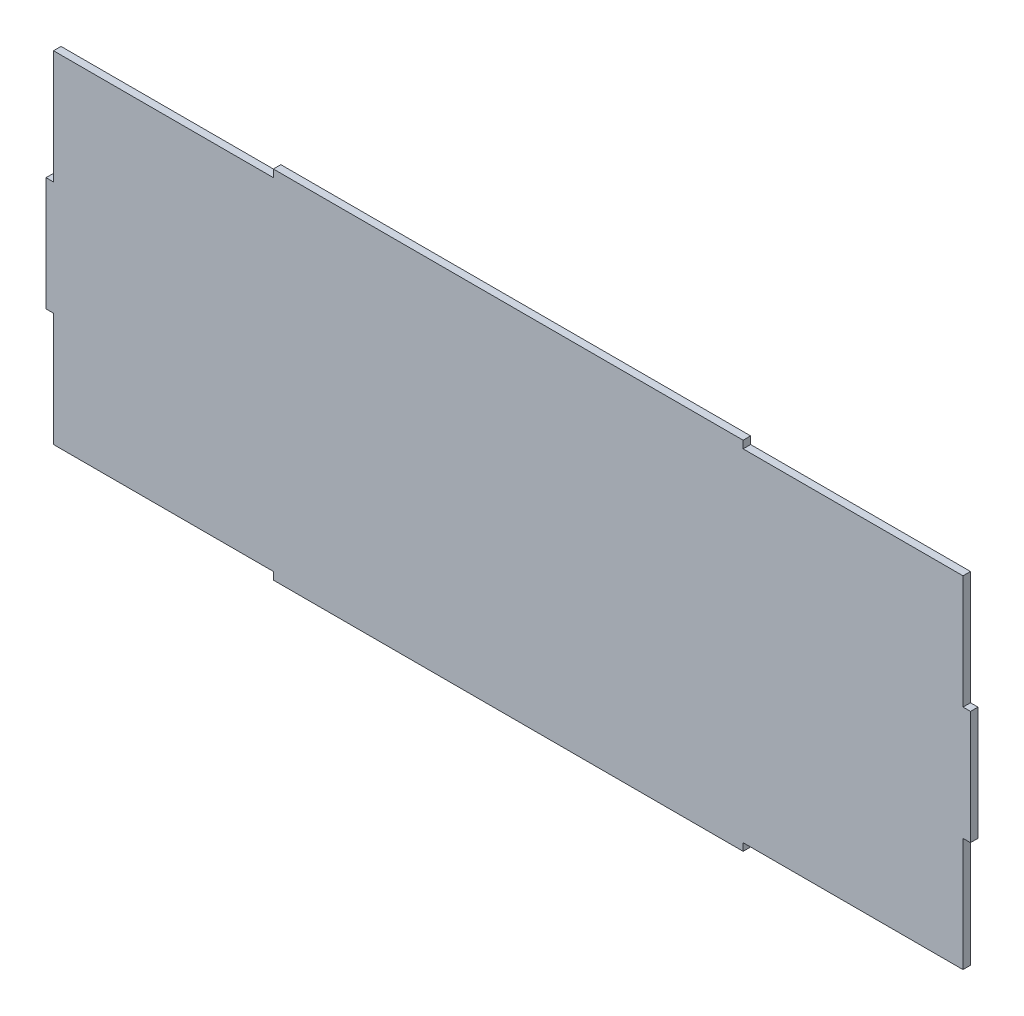
ISO-10303-21;
HEADER;
FILE_DESCRIPTION(('STEP AP214'),'2;1');
FILE_NAME('part.step','',(''),(''),'','','');
FILE_SCHEMA(('AUTOMOTIVE_DESIGN { 1 0 10303 214 1 1 1 1 }'));
ENDSEC;
DATA;
#1=APPLICATION_CONTEXT('core data for automotive mechanical design processes');
#2=APPLICATION_PROTOCOL_DEFINITION('international standard','automotive_design',2000,#1);
#3=PRODUCT_CONTEXT('',#1,'mechanical');
#4=PRODUCT('Part','Part','',(#3));
#5=PRODUCT_RELATED_PRODUCT_CATEGORY('part','',(#4));
#6=PRODUCT_DEFINITION_FORMATION('','',#4);
#7=PRODUCT_DEFINITION_CONTEXT('part definition',#1,'design');
#8=PRODUCT_DEFINITION('design','',#6,#7);
#9=PRODUCT_DEFINITION_SHAPE('','',#8);
#10=(LENGTH_UNIT() NAMED_UNIT(*) SI_UNIT(.MILLI.,.METRE.));
#11=(NAMED_UNIT(*) PLANE_ANGLE_UNIT() SI_UNIT($,.RADIAN.));
#12=(NAMED_UNIT(*) SI_UNIT($,.STERADIAN.) SOLID_ANGLE_UNIT());
#13=UNCERTAINTY_MEASURE_WITH_UNIT(LENGTH_MEASURE(1.E-05),#10,'distance_accuracy_value','');
#14=(GEOMETRIC_REPRESENTATION_CONTEXT(3) GLOBAL_UNCERTAINTY_ASSIGNED_CONTEXT((#13)) GLOBAL_UNIT_ASSIGNED_CONTEXT((#10,
#11,#12)) REPRESENTATION_CONTEXT('',''));
#15=CARTESIAN_POINT('',(0.,0.,0.));
#16=DIRECTION('',(0.,0.,1.));
#17=DIRECTION('',(1.,0.,0.));
#18=AXIS2_PLACEMENT_3D('',#15,#16,#17);
#19=CARTESIAN_POINT('',(-200.,75.,3.3));
#20=DIRECTION('',(0.,-1.,0.));
#21=DIRECTION('',(0.,0.,-1.));
#22=AXIS2_PLACEMENT_3D('',#19,#20,#21);
#23=PLANE('',#22);
#24=DIRECTION('',(-1.,0.,0.));
#25=VECTOR('',#24,1.);
#26=CARTESIAN_POINT('',(-200.,75.,0.));
#27=LINE('',#26,#25);
#28=CARTESIAN_POINT('',(-103.3,75.,0.));
#29=VERTEX_POINT('',#28);
#30=CARTESIAN_POINT('',(-200.,75.,0.));
#31=VERTEX_POINT('',#30);
#32=EDGE_CURVE('E212',#29,#31,#27,.T.);
#33=ORIENTED_EDGE('',*,*,#32,.T.);
#34=DIRECTION('',(0.,0.,-1.));
#35=VECTOR('',#34,1.);
#36=CARTESIAN_POINT('',(-200.,75.,3.3));
#37=LINE('',#36,#35);
#38=CARTESIAN_POINT('',(-200.,75.,3.3));
#39=VERTEX_POINT('',#38);
#40=EDGE_CURVE('E11',#39,#31,#37,.T.);
#41=ORIENTED_EDGE('',*,*,#40,.F.);
#42=DIRECTION('',(-1.,0.,0.));
#43=VECTOR('',#42,1.);
#44=CARTESIAN_POINT('',(-200.,75.,3.3));
#45=LINE('',#44,#43);
#46=CARTESIAN_POINT('',(-103.3,75.,3.3));
#47=VERTEX_POINT('',#46);
#48=EDGE_CURVE('E270',#47,#39,#45,.T.);
#49=ORIENTED_EDGE('',*,*,#48,.F.);
#50=DIRECTION('',(0.,0.,-1.));
#51=VECTOR('',#50,1.);
#52=CARTESIAN_POINT('',(-103.3,75.,3.3));
#53=LINE('',#52,#51);
#54=EDGE_CURVE('E208',#47,#29,#53,.T.);
#55=ORIENTED_EDGE('',*,*,#54,.T.);
#56=EDGE_LOOP('',(#33,#41,#49,#55));
#57=FACE_BOUND('',#56,.T.);
#58=ADVANCED_FACE('F39',(#57),#23,.F.);
#59=CARTESIAN_POINT('',(-200.,75.,3.3));
#60=DIRECTION('',(1.,0.,0.));
#61=DIRECTION('',(0.,1.,0.));
#62=AXIS2_PLACEMENT_3D('',#59,#60,#61);
#63=PLANE('',#62);
#64=DIRECTION('',(0.,-1.,0.));
#65=VECTOR('',#64,1.);
#66=CARTESIAN_POINT('',(-200.,75.,0.));
#67=LINE('',#66,#65);
#68=CARTESIAN_POINT('',(-200.,25.,0.));
#69=VERTEX_POINT('',#68);
#70=EDGE_CURVE('E216',#31,#69,#67,.T.);
#71=ORIENTED_EDGE('',*,*,#70,.T.);
#72=DIRECTION('',(0.,0.,-1.));
#73=VECTOR('',#72,1.);
#74=CARTESIAN_POINT('',(-200.,25.,3.3));
#75=LINE('',#74,#73);
#76=CARTESIAN_POINT('',(-200.,25.,3.3));
#77=VERTEX_POINT('',#76);
#78=EDGE_CURVE('E48',#77,#69,#75,.T.);
#79=ORIENTED_EDGE('',*,*,#78,.F.);
#80=DIRECTION('',(0.,-1.,0.));
#81=VECTOR('',#80,1.);
#82=CARTESIAN_POINT('',(-200.,75.,3.3));
#83=LINE('',#82,#81);
#84=EDGE_CURVE('E135',#39,#77,#83,.T.);
#85=ORIENTED_EDGE('',*,*,#84,.F.);
#86=ORIENTED_EDGE('',*,*,#40,.T.);
#87=EDGE_LOOP('',(#71,#79,#85,#86));
#88=FACE_BOUND('',#87,.T.);
#89=ADVANCED_FACE('F420',(#88),#63,.F.);
#90=CARTESIAN_POINT('',(-200.,25.,3.3));
#91=DIRECTION('',(0.,-1.,0.));
#92=DIRECTION('',(0.,0.,-1.));
#93=AXIS2_PLACEMENT_3D('',#90,#91,#92);
#94=PLANE('',#93);
#95=DIRECTION('',(-1.,0.,0.));
#96=VECTOR('',#95,1.);
#97=CARTESIAN_POINT('',(-200.,25.,0.));
#98=LINE('',#97,#96);
#99=CARTESIAN_POINT('',(-203.3,25.,0.));
#100=VERTEX_POINT('',#99);
#101=EDGE_CURVE('E219',#69,#100,#98,.T.);
#102=ORIENTED_EDGE('',*,*,#101,.T.);
#103=DIRECTION('',(0.,0.,-1.));
#104=VECTOR('',#103,1.);
#105=CARTESIAN_POINT('',(-203.3,25.,3.3));
#106=LINE('',#105,#104);
#107=CARTESIAN_POINT('',(-203.3,25.,3.3));
#108=VERTEX_POINT('',#107);
#109=EDGE_CURVE('E329',#108,#100,#106,.T.);
#110=ORIENTED_EDGE('',*,*,#109,.F.);
#111=DIRECTION('',(-1.,0.,0.));
#112=VECTOR('',#111,1.);
#113=CARTESIAN_POINT('',(-200.,25.,3.3));
#114=LINE('',#113,#112);
#115=EDGE_CURVE('E339',#77,#108,#114,.T.);
#116=ORIENTED_EDGE('',*,*,#115,.F.);
#117=ORIENTED_EDGE('',*,*,#78,.T.);
#118=EDGE_LOOP('',(#102,#110,#116,#117));
#119=FACE_BOUND('',#118,.T.);
#120=ADVANCED_FACE('F337',(#119),#94,.F.);
#121=CARTESIAN_POINT('',(-203.3,25.,3.3));
#122=DIRECTION('',(1.,0.,0.));
#123=DIRECTION('',(0.,0.,-1.));
#124=AXIS2_PLACEMENT_3D('',#121,#122,#123);
#125=PLANE('',#124);
#126=DIRECTION('',(0.,-1.,0.));
#127=VECTOR('',#126,1.);
#128=CARTESIAN_POINT('',(-203.3,25.,0.));
#129=LINE('',#128,#127);
#130=CARTESIAN_POINT('',(-203.3,-25.,0.));
#131=VERTEX_POINT('',#130);
#132=EDGE_CURVE('E222',#100,#131,#129,.T.);
#133=ORIENTED_EDGE('',*,*,#132,.T.);
#134=DIRECTION('',(0.,0.,-1.));
#135=VECTOR('',#134,1.);
#136=CARTESIAN_POINT('',(-203.3,-25.,3.3));
#137=LINE('',#136,#135);
#138=CARTESIAN_POINT('',(-203.3,-25.,3.3));
#139=VERTEX_POINT('',#138);
#140=EDGE_CURVE('E325',#139,#131,#137,.T.);
#141=ORIENTED_EDGE('',*,*,#140,.F.);
#142=DIRECTION('',(0.,-1.,0.));
#143=VECTOR('',#142,1.);
#144=CARTESIAN_POINT('',(-203.3,25.,3.3));
#145=LINE('',#144,#143);
#146=EDGE_CURVE('E358',#108,#139,#145,.T.);
#147=ORIENTED_EDGE('',*,*,#146,.F.);
#148=ORIENTED_EDGE('',*,*,#109,.T.);
#149=EDGE_LOOP('',(#133,#141,#147,#148));
#150=FACE_BOUND('',#149,.T.);
#151=ADVANCED_FACE('F348',(#150),#125,.F.);
#152=CARTESIAN_POINT('',(-203.3,-25.,3.3));
#153=DIRECTION('',(0.,1.,0.));
#154=DIRECTION('',(0.,0.,1.));
#155=AXIS2_PLACEMENT_3D('',#152,#153,#154);
#156=PLANE('',#155);
#157=DIRECTION('',(1.,0.,0.));
#158=VECTOR('',#157,1.);
#159=CARTESIAN_POINT('',(-203.3,-25.,0.));
#160=LINE('',#159,#158);
#161=CARTESIAN_POINT('',(-200.,-25.,0.));
#162=VERTEX_POINT('',#161);
#163=EDGE_CURVE('E225',#131,#162,#160,.T.);
#164=ORIENTED_EDGE('',*,*,#163,.T.);
#165=DIRECTION('',(0.,0.,-1.));
#166=VECTOR('',#165,1.);
#167=CARTESIAN_POINT('',(-200.,-25.,3.3));
#168=LINE('',#167,#166);
#169=CARTESIAN_POINT('',(-200.,-25.,3.3));
#170=VERTEX_POINT('',#169);
#171=EDGE_CURVE('E321',#170,#162,#168,.T.);
#172=ORIENTED_EDGE('',*,*,#171,.F.);
#173=DIRECTION('',(1.,0.,0.));
#174=VECTOR('',#173,1.);
#175=CARTESIAN_POINT('',(-203.3,-25.,3.3));
#176=LINE('',#175,#174);
#177=EDGE_CURVE('E354',#139,#170,#176,.T.);
#178=ORIENTED_EDGE('',*,*,#177,.F.);
#179=ORIENTED_EDGE('',*,*,#140,.T.);
#180=EDGE_LOOP('',(#164,#172,#178,#179));
#181=FACE_BOUND('',#180,.T.);
#182=ADVANCED_FACE('F352',(#181),#156,.F.);
#183=CARTESIAN_POINT('',(-200.,-25.,3.3));
#184=DIRECTION('',(1.,0.,0.));
#185=DIRECTION('',(0.,1.,0.));
#186=AXIS2_PLACEMENT_3D('',#183,#184,#185);
#187=PLANE('',#186);
#188=DIRECTION('',(0.,-1.,0.));
#189=VECTOR('',#188,1.);
#190=CARTESIAN_POINT('',(-200.,-25.,0.));
#191=LINE('',#190,#189);
#192=CARTESIAN_POINT('',(-200.,-75.,0.));
#193=VERTEX_POINT('',#192);
#194=EDGE_CURVE('E228',#162,#193,#191,.T.);
#195=ORIENTED_EDGE('',*,*,#194,.T.);
#196=DIRECTION('',(0.,0.,-1.));
#197=VECTOR('',#196,1.);
#198=CARTESIAN_POINT('',(-200.,-75.,3.3));
#199=LINE('',#198,#197);
#200=CARTESIAN_POINT('',(-200.,-75.,3.3));
#201=VERTEX_POINT('',#200);
#202=EDGE_CURVE('E317',#201,#193,#199,.T.);
#203=ORIENTED_EDGE('',*,*,#202,.F.);
#204=DIRECTION('',(0.,-1.,0.));
#205=VECTOR('',#204,1.);
#206=CARTESIAN_POINT('',(-200.,-25.,3.3));
#207=LINE('',#206,#205);
#208=EDGE_CURVE('E357',#170,#201,#207,.T.);
#209=ORIENTED_EDGE('',*,*,#208,.F.);
#210=ORIENTED_EDGE('',*,*,#171,.T.);
#211=EDGE_LOOP('',(#195,#203,#209,#210));
#212=FACE_BOUND('',#211,.T.);
#213=ADVANCED_FACE('F433',(#212),#187,.F.);
#214=CARTESIAN_POINT('',(-103.3,-75.,3.3));
#215=DIRECTION('',(0.,1.,0.));
#216=DIRECTION('',(0.,0.,1.));
#217=AXIS2_PLACEMENT_3D('',#214,#215,#216);
#218=PLANE('',#217);
#219=DIRECTION('',(1.,0.,0.));
#220=VECTOR('',#219,1.);
#221=CARTESIAN_POINT('',(-103.3,-75.,0.));
#222=LINE('',#221,#220);
#223=CARTESIAN_POINT('',(-103.3,-75.,0.));
#224=VERTEX_POINT('',#223);
#225=EDGE_CURVE('E231',#193,#224,#222,.T.);
#226=ORIENTED_EDGE('',*,*,#225,.T.);
#227=DIRECTION('',(0.,0.,-1.));
#228=VECTOR('',#227,1.);
#229=CARTESIAN_POINT('',(-103.3,-75.,3.3));
#230=LINE('',#229,#228);
#231=CARTESIAN_POINT('',(-103.3,-75.,3.3));
#232=VERTEX_POINT('',#231);
#233=EDGE_CURVE('E313',#232,#224,#230,.T.);
#234=ORIENTED_EDGE('',*,*,#233,.F.);
#235=DIRECTION('',(1.,0.,0.));
#236=VECTOR('',#235,1.);
#237=CARTESIAN_POINT('',(-103.3,-75.,3.3));
#238=LINE('',#237,#236);
#239=EDGE_CURVE('E362',#201,#232,#238,.T.);
#240=ORIENTED_EDGE('',*,*,#239,.F.);
#241=ORIENTED_EDGE('',*,*,#202,.T.);
#242=EDGE_LOOP('',(#226,#234,#240,#241));
#243=FACE_BOUND('',#242,.T.);
#244=ADVANCED_FACE('F436',(#243),#218,.F.);
#245=CARTESIAN_POINT('',(-103.3,-78.3,3.3));
#246=DIRECTION('',(1.,0.,0.));
#247=DIRECTION('',(0.,1.,0.));
#248=AXIS2_PLACEMENT_3D('',#245,#246,#247);
#249=PLANE('',#248);
#250=DIRECTION('',(0.,-1.,0.));
#251=VECTOR('',#250,1.);
#252=CARTESIAN_POINT('',(-103.3,-78.3,0.));
#253=LINE('',#252,#251);
#254=CARTESIAN_POINT('',(-103.3,-78.3,0.));
#255=VERTEX_POINT('',#254);
#256=EDGE_CURVE('E234',#224,#255,#253,.T.);
#257=ORIENTED_EDGE('',*,*,#256,.T.);
#258=DIRECTION('',(0.,0.,-1.));
#259=VECTOR('',#258,1.);
#260=CARTESIAN_POINT('',(-103.3,-78.3,3.3));
#261=LINE('',#260,#259);
#262=CARTESIAN_POINT('',(-103.3,-78.3,3.3));
#263=VERTEX_POINT('',#262);
#264=EDGE_CURVE('E309',#263,#255,#261,.T.);
#265=ORIENTED_EDGE('',*,*,#264,.F.);
#266=DIRECTION('',(0.,-1.,0.));
#267=VECTOR('',#266,1.);
#268=CARTESIAN_POINT('',(-103.3,-78.3,3.3));
#269=LINE('',#268,#267);
#270=EDGE_CURVE('E369',#232,#263,#269,.T.);
#271=ORIENTED_EDGE('',*,*,#270,.F.);
#272=ORIENTED_EDGE('',*,*,#233,.T.);
#273=EDGE_LOOP('',(#257,#265,#271,#272));
#274=FACE_BOUND('',#273,.T.);
#275=ADVANCED_FACE('F440',(#274),#249,.F.);
#276=CARTESIAN_POINT('',(103.3,-78.3,3.3));
#277=DIRECTION('',(0.,1.,0.));
#278=DIRECTION('',(0.,0.,1.));
#279=AXIS2_PLACEMENT_3D('',#276,#277,#278);
#280=PLANE('',#279);
#281=DIRECTION('',(1.,0.,0.));
#282=VECTOR('',#281,1.);
#283=CARTESIAN_POINT('',(103.3,-78.3,0.));
#284=LINE('',#283,#282);
#285=CARTESIAN_POINT('',(103.3,-78.3,0.));
#286=VERTEX_POINT('',#285);
#287=EDGE_CURVE('E237',#255,#286,#284,.T.);
#288=ORIENTED_EDGE('',*,*,#287,.T.);
#289=DIRECTION('',(0.,0.,-1.));
#290=VECTOR('',#289,1.);
#291=CARTESIAN_POINT('',(103.3,-78.3,3.3));
#292=LINE('',#291,#290);
#293=CARTESIAN_POINT('',(103.3,-78.3,3.3));
#294=VERTEX_POINT('',#293);
#295=EDGE_CURVE('E305',#294,#286,#292,.T.);
#296=ORIENTED_EDGE('',*,*,#295,.F.);
#297=DIRECTION('',(1.,0.,0.));
#298=VECTOR('',#297,1.);
#299=CARTESIAN_POINT('',(103.3,-78.3,3.3));
#300=LINE('',#299,#298);
#301=EDGE_CURVE('E372',#263,#294,#300,.T.);
#302=ORIENTED_EDGE('',*,*,#301,.F.);
#303=ORIENTED_EDGE('',*,*,#264,.T.);
#304=EDGE_LOOP('',(#288,#296,#302,#303));
#305=FACE_BOUND('',#304,.T.);
#306=ADVANCED_FACE('F444',(#305),#280,.F.);
#307=CARTESIAN_POINT('',(103.3,-75.,3.3));
#308=DIRECTION('',(-1.,0.,0.));
#309=DIRECTION('',(0.,-1.,0.));
#310=AXIS2_PLACEMENT_3D('',#307,#308,#309);
#311=PLANE('',#310);
#312=DIRECTION('',(0.,1.,0.));
#313=VECTOR('',#312,1.);
#314=CARTESIAN_POINT('',(103.3,-75.,0.));
#315=LINE('',#314,#313);
#316=CARTESIAN_POINT('',(103.3,-75.,0.));
#317=VERTEX_POINT('',#316);
#318=EDGE_CURVE('E240',#286,#317,#315,.T.);
#319=ORIENTED_EDGE('',*,*,#318,.T.);
#320=DIRECTION('',(0.,0.,-1.));
#321=VECTOR('',#320,1.);
#322=CARTESIAN_POINT('',(103.3,-75.,3.3));
#323=LINE('',#322,#321);
#324=CARTESIAN_POINT('',(103.3,-75.,3.3));
#325=VERTEX_POINT('',#324);
#326=EDGE_CURVE('E301',#325,#317,#323,.T.);
#327=ORIENTED_EDGE('',*,*,#326,.F.);
#328=DIRECTION('',(0.,1.,0.));
#329=VECTOR('',#328,1.);
#330=CARTESIAN_POINT('',(103.3,-75.,3.3));
#331=LINE('',#330,#329);
#332=EDGE_CURVE('E375',#294,#325,#331,.T.);
#333=ORIENTED_EDGE('',*,*,#332,.F.);
#334=ORIENTED_EDGE('',*,*,#295,.T.);
#335=EDGE_LOOP('',(#319,#327,#333,#334));
#336=FACE_BOUND('',#335,.T.);
#337=ADVANCED_FACE('F448',(#336),#311,.F.);
#338=CARTESIAN_POINT('',(200.,-75.,3.3));
#339=DIRECTION('',(0.,1.,0.));
#340=DIRECTION('',(0.,0.,1.));
#341=AXIS2_PLACEMENT_3D('',#338,#339,#340);
#342=PLANE('',#341);
#343=DIRECTION('',(1.,0.,0.));
#344=VECTOR('',#343,1.);
#345=CARTESIAN_POINT('',(200.,-75.,0.));
#346=LINE('',#345,#344);
#347=CARTESIAN_POINT('',(200.,-75.,0.));
#348=VERTEX_POINT('',#347);
#349=EDGE_CURVE('E243',#317,#348,#346,.T.);
#350=ORIENTED_EDGE('',*,*,#349,.T.);
#351=DIRECTION('',(0.,0.,-1.));
#352=VECTOR('',#351,1.);
#353=CARTESIAN_POINT('',(200.,-75.,3.3));
#354=LINE('',#353,#352);
#355=CARTESIAN_POINT('',(200.,-75.,3.3));
#356=VERTEX_POINT('',#355);
#357=EDGE_CURVE('E297',#356,#348,#354,.T.);
#358=ORIENTED_EDGE('',*,*,#357,.F.);
#359=DIRECTION('',(1.,0.,0.));
#360=VECTOR('',#359,1.);
#361=CARTESIAN_POINT('',(200.,-75.,3.3));
#362=LINE('',#361,#360);
#363=EDGE_CURVE('E378',#325,#356,#362,.T.);
#364=ORIENTED_EDGE('',*,*,#363,.F.);
#365=ORIENTED_EDGE('',*,*,#326,.T.);
#366=EDGE_LOOP('',(#350,#358,#364,#365));
#367=FACE_BOUND('',#366,.T.);
#368=ADVANCED_FACE('F452',(#367),#342,.F.);
#369=CARTESIAN_POINT('',(200.,-25.,3.3));
#370=DIRECTION('',(-1.,0.,0.));
#371=DIRECTION('',(0.,0.,1.));
#372=AXIS2_PLACEMENT_3D('',#369,#370,#371);
#373=PLANE('',#372);
#374=DIRECTION('',(0.,1.,0.));
#375=VECTOR('',#374,1.);
#376=CARTESIAN_POINT('',(200.,-25.,0.));
#377=LINE('',#376,#375);
#378=CARTESIAN_POINT('',(200.,-25.,0.));
#379=VERTEX_POINT('',#378);
#380=EDGE_CURVE('E246',#348,#379,#377,.T.);
#381=ORIENTED_EDGE('',*,*,#380,.T.);
#382=DIRECTION('',(0.,0.,-1.));
#383=VECTOR('',#382,1.);
#384=CARTESIAN_POINT('',(200.,-25.,3.3));
#385=LINE('',#384,#383);
#386=CARTESIAN_POINT('',(200.,-25.,3.3));
#387=VERTEX_POINT('',#386);
#388=EDGE_CURVE('E293',#387,#379,#385,.T.);
#389=ORIENTED_EDGE('',*,*,#388,.F.);
#390=DIRECTION('',(0.,1.,0.));
#391=VECTOR('',#390,1.);
#392=CARTESIAN_POINT('',(200.,-25.,3.3));
#393=LINE('',#392,#391);
#394=EDGE_CURVE('E381',#356,#387,#393,.T.);
#395=ORIENTED_EDGE('',*,*,#394,.F.);
#396=ORIENTED_EDGE('',*,*,#357,.T.);
#397=EDGE_LOOP('',(#381,#389,#395,#396));
#398=FACE_BOUND('',#397,.T.);
#399=ADVANCED_FACE('F456',(#398),#373,.F.);
#400=CARTESIAN_POINT('',(203.3,-25.,3.3));
#401=DIRECTION('',(0.,1.,0.));
#402=DIRECTION('',(0.,0.,1.));
#403=AXIS2_PLACEMENT_3D('',#400,#401,#402);
#404=PLANE('',#403);
#405=DIRECTION('',(1.,0.,0.));
#406=VECTOR('',#405,1.);
#407=CARTESIAN_POINT('',(203.3,-25.,0.));
#408=LINE('',#407,#406);
#409=CARTESIAN_POINT('',(203.3,-25.,0.));
#410=VERTEX_POINT('',#409);
#411=EDGE_CURVE('E249',#379,#410,#408,.T.);
#412=ORIENTED_EDGE('',*,*,#411,.T.);
#413=DIRECTION('',(0.,0.,-1.));
#414=VECTOR('',#413,1.);
#415=CARTESIAN_POINT('',(203.3,-25.,3.3));
#416=LINE('',#415,#414);
#417=CARTESIAN_POINT('',(203.3,-25.,3.3));
#418=VERTEX_POINT('',#417);
#419=EDGE_CURVE('E289',#418,#410,#416,.T.);
#420=ORIENTED_EDGE('',*,*,#419,.F.);
#421=DIRECTION('',(1.,0.,0.));
#422=VECTOR('',#421,1.);
#423=CARTESIAN_POINT('',(203.3,-25.,3.3));
#424=LINE('',#423,#422);
#425=EDGE_CURVE('E384',#387,#418,#424,.T.);
#426=ORIENTED_EDGE('',*,*,#425,.F.);
#427=ORIENTED_EDGE('',*,*,#388,.T.);
#428=EDGE_LOOP('',(#412,#420,#426,#427));
#429=FACE_BOUND('',#428,.T.);
#430=ADVANCED_FACE('F460',(#429),#404,.F.);
#431=CARTESIAN_POINT('',(203.3,25.,3.3));
#432=DIRECTION('',(-1.,0.,0.));
#433=DIRECTION('',(0.,-1.,0.));
#434=AXIS2_PLACEMENT_3D('',#431,#432,#433);
#435=PLANE('',#434);
#436=DIRECTION('',(0.,1.,0.));
#437=VECTOR('',#436,1.);
#438=CARTESIAN_POINT('',(203.3,25.,0.));
#439=LINE('',#438,#437);
#440=CARTESIAN_POINT('',(203.3,25.,0.));
#441=VERTEX_POINT('',#440);
#442=EDGE_CURVE('E252',#410,#441,#439,.T.);
#443=ORIENTED_EDGE('',*,*,#442,.T.);
#444=DIRECTION('',(0.,0.,-1.));
#445=VECTOR('',#444,1.);
#446=CARTESIAN_POINT('',(203.3,25.,3.3));
#447=LINE('',#446,#445);
#448=CARTESIAN_POINT('',(203.3,25.,3.3));
#449=VERTEX_POINT('',#448);
#450=EDGE_CURVE('E285',#449,#441,#447,.T.);
#451=ORIENTED_EDGE('',*,*,#450,.F.);
#452=DIRECTION('',(0.,1.,0.));
#453=VECTOR('',#452,1.);
#454=CARTESIAN_POINT('',(203.3,25.,3.3));
#455=LINE('',#454,#453);
#456=EDGE_CURVE('E387',#418,#449,#455,.T.);
#457=ORIENTED_EDGE('',*,*,#456,.F.);
#458=ORIENTED_EDGE('',*,*,#419,.T.);
#459=EDGE_LOOP('',(#443,#451,#457,#458));
#460=FACE_BOUND('',#459,.T.);
#461=ADVANCED_FACE('F464',(#460),#435,.F.);
#462=CARTESIAN_POINT('',(200.,25.,3.3));
#463=DIRECTION('',(0.,-1.,0.));
#464=DIRECTION('',(0.,0.,-1.));
#465=AXIS2_PLACEMENT_3D('',#462,#463,#464);
#466=PLANE('',#465);
#467=DIRECTION('',(-1.,0.,0.));
#468=VECTOR('',#467,1.);
#469=CARTESIAN_POINT('',(200.,25.,0.));
#470=LINE('',#469,#468);
#471=CARTESIAN_POINT('',(200.,25.,0.));
#472=VERTEX_POINT('',#471);
#473=EDGE_CURVE('E255',#441,#472,#470,.T.);
#474=ORIENTED_EDGE('',*,*,#473,.T.);
#475=DIRECTION('',(0.,0.,-1.));
#476=VECTOR('',#475,1.);
#477=CARTESIAN_POINT('',(200.,25.,3.3));
#478=LINE('',#477,#476);
#479=CARTESIAN_POINT('',(200.,25.,3.3));
#480=VERTEX_POINT('',#479);
#481=EDGE_CURVE('E281',#480,#472,#478,.T.);
#482=ORIENTED_EDGE('',*,*,#481,.F.);
#483=DIRECTION('',(-1.,0.,0.));
#484=VECTOR('',#483,1.);
#485=CARTESIAN_POINT('',(200.,25.,3.3));
#486=LINE('',#485,#484);
#487=EDGE_CURVE('E390',#449,#480,#486,.T.);
#488=ORIENTED_EDGE('',*,*,#487,.F.);
#489=ORIENTED_EDGE('',*,*,#450,.T.);
#490=EDGE_LOOP('',(#474,#482,#488,#489));
#491=FACE_BOUND('',#490,.T.);
#492=ADVANCED_FACE('F468',(#491),#466,.F.);
#493=CARTESIAN_POINT('',(200.,75.,3.3));
#494=DIRECTION('',(-1.,0.,0.));
#495=DIRECTION('',(0.,0.,1.));
#496=AXIS2_PLACEMENT_3D('',#493,#494,#495);
#497=PLANE('',#496);
#498=DIRECTION('',(0.,1.,0.));
#499=VECTOR('',#498,1.);
#500=CARTESIAN_POINT('',(200.,75.,0.));
#501=LINE('',#500,#499);
#502=CARTESIAN_POINT('',(200.,75.,0.));
#503=VERTEX_POINT('',#502);
#504=EDGE_CURVE('E258',#472,#503,#501,.T.);
#505=ORIENTED_EDGE('',*,*,#504,.T.);
#506=DIRECTION('',(0.,0.,-1.));
#507=VECTOR('',#506,1.);
#508=CARTESIAN_POINT('',(200.,75.,3.3));
#509=LINE('',#508,#507);
#510=CARTESIAN_POINT('',(200.,75.,3.3));
#511=VERTEX_POINT('',#510);
#512=EDGE_CURVE('E277',#511,#503,#509,.T.);
#513=ORIENTED_EDGE('',*,*,#512,.F.);
#514=DIRECTION('',(0.,1.,0.));
#515=VECTOR('',#514,1.);
#516=CARTESIAN_POINT('',(200.,75.,3.3));
#517=LINE('',#516,#515);
#518=EDGE_CURVE('E393',#480,#511,#517,.T.);
#519=ORIENTED_EDGE('',*,*,#518,.F.);
#520=ORIENTED_EDGE('',*,*,#481,.T.);
#521=EDGE_LOOP('',(#505,#513,#519,#520));
#522=FACE_BOUND('',#521,.T.);
#523=ADVANCED_FACE('F401',(#522),#497,.F.);
#524=CARTESIAN_POINT('',(103.3,75.,3.3));
#525=DIRECTION('',(0.,-1.,0.));
#526=DIRECTION('',(0.,0.,-1.));
#527=AXIS2_PLACEMENT_3D('',#524,#525,#526);
#528=PLANE('',#527);
#529=DIRECTION('',(-1.,0.,0.));
#530=VECTOR('',#529,1.);
#531=CARTESIAN_POINT('',(103.3,75.,0.));
#532=LINE('',#531,#530);
#533=CARTESIAN_POINT('',(103.3,75.,0.));
#534=VERTEX_POINT('',#533);
#535=EDGE_CURVE('E261',#503,#534,#532,.T.);
#536=ORIENTED_EDGE('',*,*,#535,.T.);
#537=DIRECTION('',(0.,0.,-1.));
#538=VECTOR('',#537,1.);
#539=CARTESIAN_POINT('',(103.3,75.,3.3));
#540=LINE('',#539,#538);
#541=CARTESIAN_POINT('',(103.3,75.,3.3));
#542=VERTEX_POINT('',#541);
#543=EDGE_CURVE('E201',#542,#534,#540,.T.);
#544=ORIENTED_EDGE('',*,*,#543,.F.);
#545=DIRECTION('',(-1.,0.,0.));
#546=VECTOR('',#545,1.);
#547=CARTESIAN_POINT('',(103.3,75.,3.3));
#548=LINE('',#547,#546);
#549=EDGE_CURVE('E190',#511,#542,#548,.T.);
#550=ORIENTED_EDGE('',*,*,#549,.F.);
#551=ORIENTED_EDGE('',*,*,#512,.T.);
#552=EDGE_LOOP('',(#536,#544,#550,#551));
#553=FACE_BOUND('',#552,.T.);
#554=ADVANCED_FACE('F405',(#553),#528,.F.);
#555=CARTESIAN_POINT('',(103.3,78.3,3.3));
#556=DIRECTION('',(-1.,0.,0.));
#557=DIRECTION('',(0.,-1.,0.));
#558=AXIS2_PLACEMENT_3D('',#555,#556,#557);
#559=PLANE('',#558);
#560=DIRECTION('',(0.,1.,0.));
#561=VECTOR('',#560,1.);
#562=CARTESIAN_POINT('',(103.3,78.3,0.));
#563=LINE('',#562,#561);
#564=CARTESIAN_POINT('',(103.3,78.3,0.));
#565=VERTEX_POINT('',#564);
#566=EDGE_CURVE('E199',#534,#565,#563,.T.);
#567=ORIENTED_EDGE('',*,*,#566,.T.);
#568=DIRECTION('',(0.,0.,-1.));
#569=VECTOR('',#568,1.);
#570=CARTESIAN_POINT('',(103.3,78.3,3.3));
#571=LINE('',#570,#569);
#572=CARTESIAN_POINT('',(103.3,78.3,3.3));
#573=VERTEX_POINT('',#572);
#574=EDGE_CURVE('E196',#573,#565,#571,.T.);
#575=ORIENTED_EDGE('',*,*,#574,.F.);
#576=DIRECTION('',(0.,1.,0.));
#577=VECTOR('',#576,1.);
#578=CARTESIAN_POINT('',(103.3,78.3,3.3));
#579=LINE('',#578,#577);
#580=EDGE_CURVE('E184',#542,#573,#579,.T.);
#581=ORIENTED_EDGE('',*,*,#580,.F.);
#582=ORIENTED_EDGE('',*,*,#543,.T.);
#583=EDGE_LOOP('',(#567,#575,#581,#582));
#584=FACE_BOUND('',#583,.T.);
#585=ADVANCED_FACE('F197',(#584),#559,.F.);
#586=CARTESIAN_POINT('',(-103.3,78.3,3.3));
#587=DIRECTION('',(0.,-1.,0.));
#588=DIRECTION('',(0.,0.,-1.));
#589=AXIS2_PLACEMENT_3D('',#586,#587,#588);
#590=PLANE('',#589);
#591=DIRECTION('',(-1.,0.,0.));
#592=VECTOR('',#591,1.);
#593=CARTESIAN_POINT('',(-103.3,78.3,0.));
#594=LINE('',#593,#592);
#595=CARTESIAN_POINT('',(-103.3,78.3,0.));
#596=VERTEX_POINT('',#595);
#597=EDGE_CURVE('E121',#565,#596,#594,.T.);
#598=ORIENTED_EDGE('',*,*,#597,.T.);
#599=DIRECTION('',(0.,0.,-1.));
#600=VECTOR('',#599,1.);
#601=CARTESIAN_POINT('',(-103.3,78.3,3.3));
#602=LINE('',#601,#600);
#603=CARTESIAN_POINT('',(-103.3,78.3,3.3));
#604=VERTEX_POINT('',#603);
#605=EDGE_CURVE('E202',#604,#596,#602,.T.);
#606=ORIENTED_EDGE('',*,*,#605,.F.);
#607=DIRECTION('',(-1.,0.,0.));
#608=VECTOR('',#607,1.);
#609=CARTESIAN_POINT('',(-103.3,78.3,3.3));
#610=LINE('',#609,#608);
#611=EDGE_CURVE('E188',#573,#604,#610,.T.);
#612=ORIENTED_EDGE('',*,*,#611,.F.);
#613=ORIENTED_EDGE('',*,*,#574,.T.);
#614=EDGE_LOOP('',(#598,#606,#612,#613));
#615=FACE_BOUND('',#614,.T.);
#616=ADVANCED_FACE('F204',(#615),#590,.F.);
#617=CARTESIAN_POINT('',(-103.3,78.3,3.3));
#618=DIRECTION('',(1.,0.,0.));
#619=DIRECTION('',(0.,1.,0.));
#620=AXIS2_PLACEMENT_3D('',#617,#618,#619);
#621=PLANE('',#620);
#622=DIRECTION('',(0.,-1.,0.));
#623=VECTOR('',#622,1.);
#624=CARTESIAN_POINT('',(-103.3,78.3,0.));
#625=LINE('',#624,#623);
#626=EDGE_CURVE('E127',#596,#29,#625,.T.);
#627=ORIENTED_EDGE('',*,*,#626,.T.);
#628=ORIENTED_EDGE('',*,*,#54,.F.);
#629=DIRECTION('',(0.,-1.,0.));
#630=VECTOR('',#629,1.);
#631=CARTESIAN_POINT('',(-103.3,78.3,3.3));
#632=LINE('',#631,#630);
#633=EDGE_CURVE('E56',#604,#47,#632,.T.);
#634=ORIENTED_EDGE('',*,*,#633,.F.);
#635=ORIENTED_EDGE('',*,*,#605,.T.);
#636=EDGE_LOOP('',(#627,#628,#634,#635));
#637=FACE_BOUND('',#636,.T.);
#638=ADVANCED_FACE('F409',(#637),#621,.F.);
#639=CARTESIAN_POINT('',(0.,0.,3.3));
#640=DIRECTION('',(0.,0.,-1.));
#641=DIRECTION('',(-1.,0.,0.));
#642=AXIS2_PLACEMENT_3D('',#639,#640,#641);
#643=PLANE('',#642);
#644=ORIENTED_EDGE('',*,*,#48,.T.);
#645=ORIENTED_EDGE('',*,*,#84,.T.);
#646=ORIENTED_EDGE('',*,*,#115,.T.);
#647=ORIENTED_EDGE('',*,*,#146,.T.);
#648=ORIENTED_EDGE('',*,*,#177,.T.);
#649=ORIENTED_EDGE('',*,*,#208,.T.);
#650=ORIENTED_EDGE('',*,*,#239,.T.);
#651=ORIENTED_EDGE('',*,*,#270,.T.);
#652=ORIENTED_EDGE('',*,*,#301,.T.);
#653=ORIENTED_EDGE('',*,*,#332,.T.);
#654=ORIENTED_EDGE('',*,*,#363,.T.);
#655=ORIENTED_EDGE('',*,*,#394,.T.);
#656=ORIENTED_EDGE('',*,*,#425,.T.);
#657=ORIENTED_EDGE('',*,*,#456,.T.);
#658=ORIENTED_EDGE('',*,*,#487,.T.);
#659=ORIENTED_EDGE('',*,*,#518,.T.);
#660=ORIENTED_EDGE('',*,*,#549,.T.);
#661=ORIENTED_EDGE('',*,*,#580,.T.);
#662=ORIENTED_EDGE('',*,*,#611,.T.);
#663=ORIENTED_EDGE('',*,*,#633,.T.);
#664=EDGE_LOOP('',(#644,#645,#646,#647,#648,#649,#650,#651,#652,#653,#654,#655,#656,#657,#658,
#659,#660,#661,#662,#663));
#665=FACE_BOUND('',#664,.T.);
#666=ADVANCED_FACE('F186',(#665),#643,.F.);
#667=CARTESIAN_POINT('',(0.,0.,0.));
#668=DIRECTION('',(0.,0.,-1.));
#669=DIRECTION('',(-1.,0.,0.));
#670=AXIS2_PLACEMENT_3D('',#667,#668,#669);
#671=PLANE('',#670);
#672=ORIENTED_EDGE('',*,*,#32,.F.);
#673=ORIENTED_EDGE('',*,*,#626,.F.);
#674=ORIENTED_EDGE('',*,*,#597,.F.);
#675=ORIENTED_EDGE('',*,*,#566,.F.);
#676=ORIENTED_EDGE('',*,*,#535,.F.);
#677=ORIENTED_EDGE('',*,*,#504,.F.);
#678=ORIENTED_EDGE('',*,*,#473,.F.);
#679=ORIENTED_EDGE('',*,*,#442,.F.);
#680=ORIENTED_EDGE('',*,*,#411,.F.);
#681=ORIENTED_EDGE('',*,*,#380,.F.);
#682=ORIENTED_EDGE('',*,*,#349,.F.);
#683=ORIENTED_EDGE('',*,*,#318,.F.);
#684=ORIENTED_EDGE('',*,*,#287,.F.);
#685=ORIENTED_EDGE('',*,*,#256,.F.);
#686=ORIENTED_EDGE('',*,*,#225,.F.);
#687=ORIENTED_EDGE('',*,*,#194,.F.);
#688=ORIENTED_EDGE('',*,*,#163,.F.);
#689=ORIENTED_EDGE('',*,*,#132,.F.);
#690=ORIENTED_EDGE('',*,*,#101,.F.);
#691=ORIENTED_EDGE('',*,*,#70,.F.);
#692=EDGE_LOOP('',(#672,#673,#674,#675,#676,#677,#678,#679,#680,#681,#682,#683,#684,#685,#686,
#687,#688,#689,#690,#691));
#693=FACE_BOUND('',#692,.T.);
#694=ADVANCED_FACE('F343',(#693),#671,.T.);
#695=CLOSED_SHELL('',(#58,#89,#120,#151,#182,#213,#244,#275,#306,#337,#368,#399,#430,#461,#492,
#523,#554,#585,#616,#638,#666,#694));
#696=MANIFOLD_SOLID_BREP('B2',#695);
#697=ADVANCED_BREP_SHAPE_REPRESENTATION('',(#18,#696),#14);
#698=SHAPE_DEFINITION_REPRESENTATION(#9,#697);
ENDSEC;
END-ISO-10303-21;
